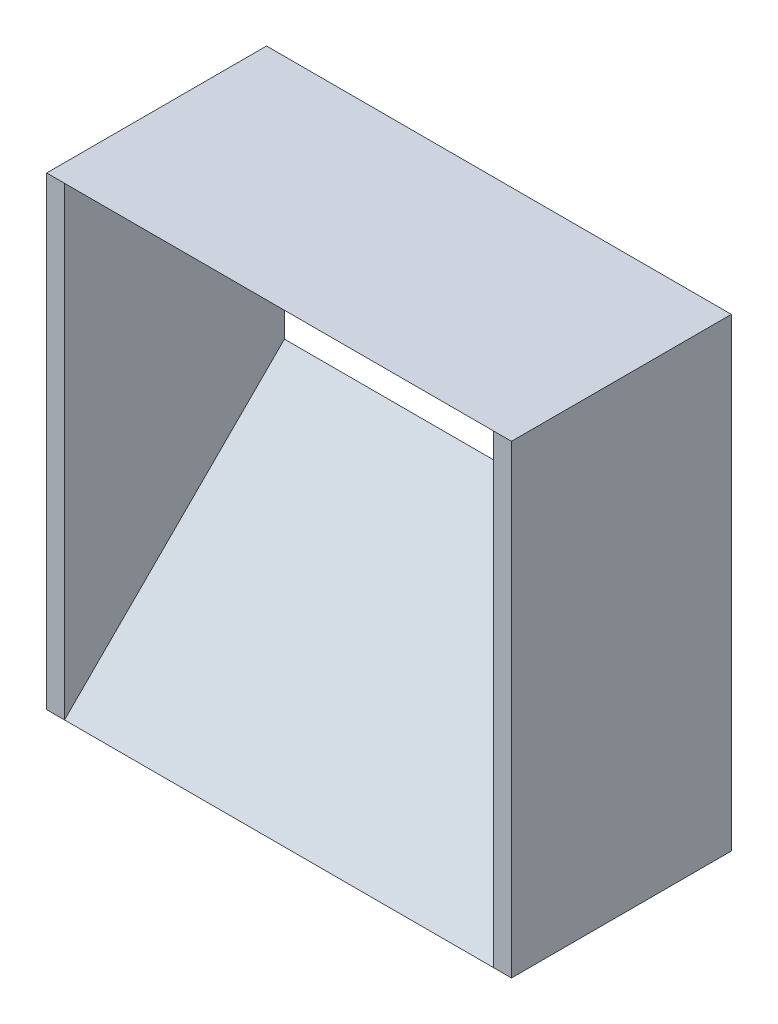
ISO-10303-21;
HEADER;
FILE_DESCRIPTION(('STEP AP214'),'2;1');
FILE_NAME('part.step','',(''),(''),'','','');
FILE_SCHEMA(('AUTOMOTIVE_DESIGN { 1 0 10303 214 1 1 1 1 }'));
ENDSEC;
DATA;
#1=APPLICATION_CONTEXT('core data for automotive mechanical design processes');
#2=APPLICATION_PROTOCOL_DEFINITION('international standard','automotive_design',2000,#1);
#3=PRODUCT_CONTEXT('',#1,'mechanical');
#4=PRODUCT('Part','Part','',(#3));
#5=PRODUCT_RELATED_PRODUCT_CATEGORY('part','',(#4));
#6=PRODUCT_DEFINITION_FORMATION('','',#4);
#7=PRODUCT_DEFINITION_CONTEXT('part definition',#1,'design');
#8=PRODUCT_DEFINITION('design','',#6,#7);
#9=PRODUCT_DEFINITION_SHAPE('','',#8);
#10=(LENGTH_UNIT() NAMED_UNIT(*) SI_UNIT(.MILLI.,.METRE.));
#11=(NAMED_UNIT(*) PLANE_ANGLE_UNIT() SI_UNIT($,.RADIAN.));
#12=(NAMED_UNIT(*) SI_UNIT($,.STERADIAN.) SOLID_ANGLE_UNIT());
#13=UNCERTAINTY_MEASURE_WITH_UNIT(LENGTH_MEASURE(1.E-05),#10,'distance_accuracy_value','');
#14=(GEOMETRIC_REPRESENTATION_CONTEXT(3) GLOBAL_UNCERTAINTY_ASSIGNED_CONTEXT((#13)) GLOBAL_UNIT_ASSIGNED_CONTEXT((#10,
#11,#12)) REPRESENTATION_CONTEXT('',''));
#15=CARTESIAN_POINT('',(0.,0.,0.));
#16=DIRECTION('',(0.,0.,1.));
#17=DIRECTION('',(1.,0.,0.));
#18=AXIS2_PLACEMENT_3D('',#15,#16,#17);
#19=CARTESIAN_POINT('',(60.,0.,0.));
#20=DIRECTION('',(1.,0.,0.));
#21=DIRECTION('',(0.,0.,-1.));
#22=AXIS2_PLACEMENT_3D('',#19,#20,#21);
#23=PLANE('',#22);
#24=DIRECTION('',(0.,-1.,0.));
#25=VECTOR('',#24,1.);
#26=CARTESIAN_POINT('',(60.,-64.9999999999999,61.5000000000003));
#27=LINE('',#26,#25);
#28=CARTESIAN_POINT('',(60.,64.9999999999989,61.5000000000003));
#29=VERTEX_POINT('',#28);
#30=CARTESIAN_POINT('',(60.,-64.9999999999999,61.5000000000003));
#31=VERTEX_POINT('',#30);
#32=EDGE_CURVE('E208',#29,#31,#27,.T.);
#33=ORIENTED_EDGE('',*,*,#32,.F.);
#34=DIRECTION('',(0.,-0.707106781186546,-0.707106781186549));
#35=VECTOR('',#34,1.);
#36=CARTESIAN_POINT('',(60.,3.5,0.));
#37=LINE('',#36,#35);
#38=CARTESIAN_POINT('',(60.,3.5,0.));
#39=VERTEX_POINT('',#38);
#40=EDGE_CURVE('E194',#29,#39,#37,.T.);
#41=ORIENTED_EDGE('',*,*,#40,.T.);
#42=DIRECTION('',(0.,1.,0.));
#43=VECTOR('',#42,1.);
#44=CARTESIAN_POINT('',(60.,-64.9999999999999,0.));
#45=LINE('',#44,#43);
#46=CARTESIAN_POINT('',(60.,-3.5,0.));
#47=VERTEX_POINT('',#46);
#48=EDGE_CURVE('E215',#47,#39,#45,.T.);
#49=ORIENTED_EDGE('',*,*,#48,.F.);
#50=DIRECTION('',(0.,-0.707106781186546,0.707106781186549));
#51=VECTOR('',#50,1.);
#52=CARTESIAN_POINT('',(60.,-64.9999999999999,61.5000000000003));
#53=LINE('',#52,#51);
#54=EDGE_CURVE('E232',#47,#31,#53,.T.);
#55=ORIENTED_EDGE('',*,*,#54,.T.);
#56=EDGE_LOOP('',(#33,#41,#49,#55));
#57=FACE_BOUND('',#56,.T.);
#58=ADVANCED_FACE('F39',(#57),#23,.F.);
#59=CARTESIAN_POINT('',(-60.,-64.9999999999999,61.5000000000003));
#60=DIRECTION('',(0.,-1.,0.));
#61=DIRECTION('',(0.,0.,-1.));
#62=AXIS2_PLACEMENT_3D('',#59,#60,#61);
#63=PLANE('',#62);
#64=DIRECTION('',(1.,0.,0.));
#65=VECTOR('',#64,1.);
#66=CARTESIAN_POINT('',(-60.,-64.9999999999988,0.));
#67=LINE('',#66,#65);
#68=CARTESIAN_POINT('',(-65.,-64.9999999999999,0.));
#69=VERTEX_POINT('',#68);
#70=CARTESIAN_POINT('',(65.,-64.9999999999999,0.));
#71=VERTEX_POINT('',#70);
#72=EDGE_CURVE('E43',#69,#71,#67,.T.);
#73=ORIENTED_EDGE('',*,*,#72,.T.);
#74=DIRECTION('',(0.,0.,-1.));
#75=VECTOR('',#74,1.);
#76=CARTESIAN_POINT('',(65.,-64.9999999999999,61.5000000000003));
#77=LINE('',#76,#75);
#78=CARTESIAN_POINT('',(65.,-64.9999999999999,61.5000000000003));
#79=VERTEX_POINT('',#78);
#80=EDGE_CURVE('E204',#79,#71,#77,.T.);
#81=ORIENTED_EDGE('',*,*,#80,.F.);
#82=DIRECTION('',(-1.,0.,0.));
#83=VECTOR('',#82,1.);
#84=CARTESIAN_POINT('',(65.,-64.9999999999999,61.5000000000003));
#85=LINE('',#84,#83);
#86=EDGE_CURVE('E214',#79,#31,#85,.T.);
#87=ORIENTED_EDGE('',*,*,#86,.T.);
#88=DIRECTION('',(1.,0.,0.));
#89=VECTOR('',#88,1.);
#90=CARTESIAN_POINT('',(-60.,-64.9999999999999,61.5000000000003));
#91=LINE('',#90,#89);
#92=CARTESIAN_POINT('',(-60.,-64.9999999999999,61.5000000000003));
#93=VERTEX_POINT('',#92);
#94=EDGE_CURVE('E11',#93,#31,#91,.T.);
#95=ORIENTED_EDGE('',*,*,#94,.F.);
#96=DIRECTION('',(1.,0.,0.));
#97=VECTOR('',#96,1.);
#98=CARTESIAN_POINT('',(-65.,-64.9999999999999,61.5000000000003));
#99=LINE('',#98,#97);
#100=CARTESIAN_POINT('',(-65.,-64.9999999999999,61.5000000000003));
#101=VERTEX_POINT('',#100);
#102=EDGE_CURVE('E140',#101,#93,#99,.T.);
#103=ORIENTED_EDGE('',*,*,#102,.F.);
#104=DIRECTION('',(0.,0.,-1.));
#105=VECTOR('',#104,1.);
#106=CARTESIAN_POINT('',(-65.,-64.9999999999999,61.5000000000003));
#107=LINE('',#106,#105);
#108=EDGE_CURVE('E142',#101,#69,#107,.T.);
#109=ORIENTED_EDGE('',*,*,#108,.T.);
#110=EDGE_LOOP('',(#73,#81,#87,#95,#103,#109));
#111=FACE_BOUND('',#110,.T.);
#112=ADVANCED_FACE('F41',(#111),#63,.T.);
#113=CARTESIAN_POINT('',(-60.,-64.9999999999999,61.5000000000003));
#114=DIRECTION('',(0.,0.707106781186549,0.707106781186546));
#115=DIRECTION('',(0.,-0.707106781186546,0.707106781186549));
#116=AXIS2_PLACEMENT_3D('',#113,#114,#115);
#117=PLANE('',#116);
#118=ORIENTED_EDGE('',*,*,#94,.T.);
#119=ORIENTED_EDGE('',*,*,#54,.F.);
#120=DIRECTION('',(1.,0.,0.));
#121=VECTOR('',#120,1.);
#122=CARTESIAN_POINT('',(-60.,-3.5,0.));
#123=LINE('',#122,#121);
#124=CARTESIAN_POINT('',(-60.,-3.5,0.));
#125=VERTEX_POINT('',#124);
#126=EDGE_CURVE('E48',#125,#47,#123,.T.);
#127=ORIENTED_EDGE('',*,*,#126,.F.);
#128=DIRECTION('',(0.,-0.707106781186546,0.707106781186549));
#129=VECTOR('',#128,1.);
#130=CARTESIAN_POINT('',(-60.,-64.9999999999999,61.5000000000003));
#131=LINE('',#130,#129);
#132=EDGE_CURVE('E241',#125,#93,#131,.T.);
#133=ORIENTED_EDGE('',*,*,#132,.T.);
#134=EDGE_LOOP('',(#118,#119,#127,#133));
#135=FACE_BOUND('',#134,.T.);
#136=ADVANCED_FACE('F270',(#135),#117,.T.);
#137=CARTESIAN_POINT('',(-60.,-3.5,0.));
#138=DIRECTION('',(0.,0.,-1.));
#139=DIRECTION('',(0.,1.,0.));
#140=AXIS2_PLACEMENT_3D('',#137,#138,#139);
#141=PLANE('',#140);
#142=DIRECTION('',(0.,1.,0.));
#143=VECTOR('',#142,1.);
#144=CARTESIAN_POINT('',(-60.,-64.9999999999999,0.));
#145=LINE('',#144,#143);
#146=CARTESIAN_POINT('',(-60.,-58.9999999999999,0.));
#147=VERTEX_POINT('',#146);
#148=CARTESIAN_POINT('',(-60.,-9.5,0.));
#149=VERTEX_POINT('',#148);
#150=EDGE_CURVE('E161',#147,#149,#145,.T.);
#151=ORIENTED_EDGE('',*,*,#150,.F.);
#152=DIRECTION('',(1.,0.,0.));
#153=VECTOR('',#152,1.);
#154=CARTESIAN_POINT('',(-60.,-58.9999999999998,0.));
#155=LINE('',#154,#153);
#156=CARTESIAN_POINT('',(60.,-58.9999999999998,0.));
#157=VERTEX_POINT('',#156);
#158=EDGE_CURVE('E247',#147,#157,#155,.T.);
#159=ORIENTED_EDGE('',*,*,#158,.T.);
#160=CARTESIAN_POINT('',(60.,-9.5,0.));
#161=VERTEX_POINT('',#160);
#162=EDGE_CURVE('E217',#157,#161,#45,.T.);
#163=ORIENTED_EDGE('',*,*,#162,.T.);
#164=DIRECTION('',(1.,0.,0.));
#165=VECTOR('',#164,1.);
#166=CARTESIAN_POINT('',(-60.,-9.5,0.));
#167=LINE('',#166,#165);
#168=EDGE_CURVE('E244',#149,#161,#167,.T.);
#169=ORIENTED_EDGE('',*,*,#168,.F.);
#170=EDGE_LOOP('',(#151,#159,#163,#169));
#171=FACE_BOUND('',#170,.T.);
#172=CARTESIAN_POINT('',(-60.,3.5,0.));
#173=VERTEX_POINT('',#172);
#174=EDGE_CURVE('E56',#125,#173,#145,.T.);
#175=ORIENTED_EDGE('',*,*,#174,.F.);
#176=ORIENTED_EDGE('',*,*,#126,.T.);
#177=ORIENTED_EDGE('',*,*,#48,.T.);
#178=DIRECTION('',(1.,0.,0.));
#179=VECTOR('',#178,1.);
#180=CARTESIAN_POINT('',(-60.,3.5,0.));
#181=LINE('',#180,#179);
#182=EDGE_CURVE('E150',#173,#39,#181,.T.);
#183=ORIENTED_EDGE('',*,*,#182,.F.);
#184=EDGE_LOOP('',(#175,#176,#177,#183));
#185=FACE_BOUND('',#184,.T.);
#186=CARTESIAN_POINT('',(-60.,9.49999999999999,0.));
#187=VERTEX_POINT('',#186);
#188=CARTESIAN_POINT('',(-60.,58.9999999999998,0.));
#189=VERTEX_POINT('',#188);
#190=EDGE_CURVE('E172',#187,#189,#145,.T.);
#191=ORIENTED_EDGE('',*,*,#190,.F.);
#192=DIRECTION('',(1.,0.,0.));
#193=VECTOR('',#192,1.);
#194=CARTESIAN_POINT('',(-60.,9.5,0.));
#195=LINE('',#194,#193);
#196=CARTESIAN_POINT('',(60.,9.5,0.));
#197=VERTEX_POINT('',#196);
#198=EDGE_CURVE('E175',#187,#197,#195,.T.);
#199=ORIENTED_EDGE('',*,*,#198,.T.);
#200=CARTESIAN_POINT('',(60.,58.9999999999998,0.));
#201=VERTEX_POINT('',#200);
#202=EDGE_CURVE('E203',#197,#201,#45,.T.);
#203=ORIENTED_EDGE('',*,*,#202,.T.);
#204=DIRECTION('',(1.,0.,0.));
#205=VECTOR('',#204,1.);
#206=CARTESIAN_POINT('',(-60.,58.9999999999998,0.));
#207=LINE('',#206,#205);
#208=EDGE_CURVE('E180',#189,#201,#207,.T.);
#209=ORIENTED_EDGE('',*,*,#208,.F.);
#210=EDGE_LOOP('',(#191,#199,#203,#209));
#211=FACE_BOUND('',#210,.T.);
#212=ORIENTED_EDGE('',*,*,#72,.F.);
#213=DIRECTION('',(0.,1.,0.));
#214=VECTOR('',#213,1.);
#215=CARTESIAN_POINT('',(-65.,-64.9999999999999,0.));
#216=LINE('',#215,#214);
#217=CARTESIAN_POINT('',(-65.,64.9999999999989,0.));
#218=VERTEX_POINT('',#217);
#219=EDGE_CURVE('E160',#69,#218,#216,.T.);
#220=ORIENTED_EDGE('',*,*,#219,.T.);
#221=DIRECTION('',(-1.,0.,0.));
#222=VECTOR('',#221,1.);
#223=CARTESIAN_POINT('',(65.,64.9999999999989,0.));
#224=LINE('',#223,#222);
#225=CARTESIAN_POINT('',(65.,64.9999999999989,0.));
#226=VERTEX_POINT('',#225);
#227=EDGE_CURVE('E224',#226,#218,#224,.T.);
#228=ORIENTED_EDGE('',*,*,#227,.F.);
#229=DIRECTION('',(0.,1.,0.));
#230=VECTOR('',#229,1.);
#231=CARTESIAN_POINT('',(65.,-64.9999999999999,0.));
#232=LINE('',#231,#230);
#233=EDGE_CURVE('E207',#71,#226,#232,.T.);
#234=ORIENTED_EDGE('',*,*,#233,.F.);
#235=EDGE_LOOP('',(#212,#220,#228,#234));
#236=FACE_BOUND('',#235,.T.);
#237=ADVANCED_FACE('F257',(#171,#185,#211,#236),#141,.T.);
#238=CARTESIAN_POINT('',(-60.,-59.,49.5000000000002));
#239=DIRECTION('',(0.,-0.707106781186549,-0.707106781186546));
#240=DIRECTION('',(0.,0.707106781186546,-0.707106781186549));
#241=AXIS2_PLACEMENT_3D('',#238,#239,#240);
#242=PLANE('',#241);
#243=ORIENTED_EDGE('',*,*,#168,.T.);
#244=DIRECTION('',(0.,0.707106781186546,-0.707106781186549));
#245=VECTOR('',#244,1.);
#246=CARTESIAN_POINT('',(60.,-59.,49.5000000000002));
#247=LINE('',#246,#245);
#248=CARTESIAN_POINT('',(60.,-59.,49.5000000000002));
#249=VERTEX_POINT('',#248);
#250=EDGE_CURVE('E229',#249,#161,#247,.T.);
#251=ORIENTED_EDGE('',*,*,#250,.F.);
#252=DIRECTION('',(1.,0.,0.));
#253=VECTOR('',#252,1.);
#254=CARTESIAN_POINT('',(-60.,-59.,49.5000000000002));
#255=LINE('',#254,#253);
#256=CARTESIAN_POINT('',(-60.,-59.,49.5000000000002));
#257=VERTEX_POINT('',#256);
#258=EDGE_CURVE('E246',#257,#249,#255,.T.);
#259=ORIENTED_EDGE('',*,*,#258,.F.);
#260=DIRECTION('',(0.,0.707106781186546,-0.707106781186549));
#261=VECTOR('',#260,1.);
#262=CARTESIAN_POINT('',(-60.,-59.,49.5000000000002));
#263=LINE('',#262,#261);
#264=EDGE_CURVE('E238',#257,#149,#263,.T.);
#265=ORIENTED_EDGE('',*,*,#264,.T.);
#266=EDGE_LOOP('',(#243,#251,#259,#265));
#267=FACE_BOUND('',#266,.T.);
#268=ADVANCED_FACE('F302',(#267),#242,.T.);
#269=CARTESIAN_POINT('',(-60.,-58.9999999999998,0.));
#270=DIRECTION('',(0.,1.,0.));
#271=DIRECTION('',(0.,0.,1.));
#272=AXIS2_PLACEMENT_3D('',#269,#270,#271);
#273=PLANE('',#272);
#274=ORIENTED_EDGE('',*,*,#258,.T.);
#275=DIRECTION('',(0.,0.,1.));
#276=VECTOR('',#275,1.);
#277=CARTESIAN_POINT('',(60.,-58.9999999999998,0.));
#278=LINE('',#277,#276);
#279=EDGE_CURVE('E226',#157,#249,#278,.T.);
#280=ORIENTED_EDGE('',*,*,#279,.F.);
#281=ORIENTED_EDGE('',*,*,#158,.F.);
#282=DIRECTION('',(0.,0.,1.));
#283=VECTOR('',#282,1.);
#284=CARTESIAN_POINT('',(-60.,-58.9999999999998,0.));
#285=LINE('',#284,#283);
#286=EDGE_CURVE('E235',#147,#257,#285,.T.);
#287=ORIENTED_EDGE('',*,*,#286,.T.);
#288=EDGE_LOOP('',(#274,#280,#281,#287));
#289=FACE_BOUND('',#288,.T.);
#290=ADVANCED_FACE('F298',(#289),#273,.T.);
#291=ORIENTED_EDGE('',*,*,#162,.F.);
#292=ORIENTED_EDGE('',*,*,#279,.T.);
#293=ORIENTED_EDGE('',*,*,#250,.T.);
#294=EDGE_LOOP('',(#291,#292,#293));
#295=FACE_BOUND('',#294,.T.);
#296=ADVANCED_FACE('F288',(#295),#23,.F.);
#297=DIRECTION('',(0.,0.707106781186546,0.707106781186549));
#298=VECTOR('',#297,1.);
#299=CARTESIAN_POINT('',(60.,58.9999999999998,49.5));
#300=LINE('',#299,#298);
#301=CARTESIAN_POINT('',(60.,58.9999999999998,49.5));
#302=VERTEX_POINT('',#301);
#303=EDGE_CURVE('E200',#197,#302,#300,.T.);
#304=ORIENTED_EDGE('',*,*,#303,.T.);
#305=DIRECTION('',(0.,0.,-1.));
#306=VECTOR('',#305,1.);
#307=CARTESIAN_POINT('',(60.,58.9999999999998,0.));
#308=LINE('',#307,#306);
#309=EDGE_CURVE('E197',#302,#201,#308,.T.);
#310=ORIENTED_EDGE('',*,*,#309,.T.);
#311=ORIENTED_EDGE('',*,*,#202,.F.);
#312=EDGE_LOOP('',(#304,#310,#311));
#313=FACE_BOUND('',#312,.T.);
#314=ADVANCED_FACE('F279',(#313),#23,.F.);
#315=CARTESIAN_POINT('',(65.,64.9999999999989,61.5000000000003));
#316=DIRECTION('',(0.,-1.,0.));
#317=DIRECTION('',(0.,0.,-1.));
#318=AXIS2_PLACEMENT_3D('',#315,#316,#317);
#319=PLANE('',#318);
#320=ORIENTED_EDGE('',*,*,#227,.T.);
#321=DIRECTION('',(0.,0.,1.));
#322=VECTOR('',#321,1.);
#323=CARTESIAN_POINT('',(-65.,64.9999999999989,61.5000000000003));
#324=LINE('',#323,#322);
#325=CARTESIAN_POINT('',(-65.,64.9999999999989,61.5000000000003));
#326=VERTEX_POINT('',#325);
#327=EDGE_CURVE('E165',#218,#326,#324,.T.);
#328=ORIENTED_EDGE('',*,*,#327,.T.);
#329=DIRECTION('',(1.,0.,0.));
#330=VECTOR('',#329,1.);
#331=CARTESIAN_POINT('',(-65.,64.9999999999989,61.5000000000003));
#332=LINE('',#331,#330);
#333=CARTESIAN_POINT('',(-60.,64.9999999999989,61.5000000000003));
#334=VERTEX_POINT('',#333);
#335=EDGE_CURVE('E151',#326,#334,#332,.T.);
#336=ORIENTED_EDGE('',*,*,#335,.T.);
#337=DIRECTION('',(1.,0.,0.));
#338=VECTOR('',#337,1.);
#339=CARTESIAN_POINT('',(-60.,65.,61.5000000000003));
#340=LINE('',#339,#338);
#341=EDGE_CURVE('E182',#334,#29,#340,.T.);
#342=ORIENTED_EDGE('',*,*,#341,.T.);
#343=DIRECTION('',(-1.,0.,0.));
#344=VECTOR('',#343,1.);
#345=CARTESIAN_POINT('',(65.,64.9999999999989,61.5000000000003));
#346=LINE('',#345,#344);
#347=CARTESIAN_POINT('',(65.,64.9999999999989,61.5000000000003));
#348=VERTEX_POINT('',#347);
#349=EDGE_CURVE('E221',#348,#29,#346,.T.);
#350=ORIENTED_EDGE('',*,*,#349,.F.);
#351=DIRECTION('',(0.,0.,1.));
#352=VECTOR('',#351,1.);
#353=CARTESIAN_POINT('',(65.,64.9999999999989,61.5000000000003));
#354=LINE('',#353,#352);
#355=EDGE_CURVE('E210',#226,#348,#354,.T.);
#356=ORIENTED_EDGE('',*,*,#355,.F.);
#357=EDGE_LOOP('',(#320,#328,#336,#342,#350,#356));
#358=FACE_BOUND('',#357,.T.);
#359=ADVANCED_FACE('F277',(#358),#319,.F.);
#360=CARTESIAN_POINT('',(65.,-64.9999999999999,61.5000000000003));
#361=DIRECTION('',(0.,0.,-1.));
#362=DIRECTION('',(-1.,0.,0.));
#363=AXIS2_PLACEMENT_3D('',#360,#361,#362);
#364=PLANE('',#363);
#365=ORIENTED_EDGE('',*,*,#32,.T.);
#366=ORIENTED_EDGE('',*,*,#86,.F.);
#367=DIRECTION('',(0.,-1.,0.));
#368=VECTOR('',#367,1.);
#369=CARTESIAN_POINT('',(65.,-64.9999999999999,61.5000000000003));
#370=LINE('',#369,#368);
#371=EDGE_CURVE('E212',#348,#79,#370,.T.);
#372=ORIENTED_EDGE('',*,*,#371,.F.);
#373=ORIENTED_EDGE('',*,*,#349,.T.);
#374=EDGE_LOOP('',(#365,#366,#372,#373));
#375=FACE_BOUND('',#374,.T.);
#376=ADVANCED_FACE('F265',(#375),#364,.F.);
#377=CARTESIAN_POINT('',(65.,0.,0.));
#378=DIRECTION('',(1.,0.,0.));
#379=DIRECTION('',(0.,0.,-1.));
#380=AXIS2_PLACEMENT_3D('',#377,#378,#379);
#381=PLANE('',#380);
#382=ORIENTED_EDGE('',*,*,#80,.T.);
#383=ORIENTED_EDGE('',*,*,#233,.T.);
#384=ORIENTED_EDGE('',*,*,#355,.T.);
#385=ORIENTED_EDGE('',*,*,#371,.T.);
#386=EDGE_LOOP('',(#382,#383,#384,#385));
#387=FACE_BOUND('',#386,.T.);
#388=ADVANCED_FACE('F260',(#387),#381,.T.);
#389=CARTESIAN_POINT('',(-60.,3.5,0.));
#390=DIRECTION('',(0.,-0.707106781186549,0.707106781186546));
#391=DIRECTION('',(0.,-0.707106781186546,-0.707106781186549));
#392=AXIS2_PLACEMENT_3D('',#389,#390,#391);
#393=PLANE('',#392);
#394=ORIENTED_EDGE('',*,*,#182,.T.);
#395=ORIENTED_EDGE('',*,*,#40,.F.);
#396=ORIENTED_EDGE('',*,*,#341,.F.);
#397=DIRECTION('',(0.,-0.707106781186546,-0.707106781186549));
#398=VECTOR('',#397,1.);
#399=CARTESIAN_POINT('',(-60.,3.5,0.));
#400=LINE('',#399,#398);
#401=EDGE_CURVE('E177',#334,#173,#400,.T.);
#402=ORIENTED_EDGE('',*,*,#401,.T.);
#403=EDGE_LOOP('',(#394,#395,#396,#402));
#404=FACE_BOUND('',#403,.T.);
#405=ADVANCED_FACE('F275',(#404),#393,.T.);
#406=CARTESIAN_POINT('',(-60.,58.9999999999998,0.));
#407=DIRECTION('',(0.,-1.,0.));
#408=DIRECTION('',(0.,0.,-1.));
#409=AXIS2_PLACEMENT_3D('',#406,#407,#408);
#410=PLANE('',#409);
#411=ORIENTED_EDGE('',*,*,#208,.T.);
#412=ORIENTED_EDGE('',*,*,#309,.F.);
#413=DIRECTION('',(1.,0.,0.));
#414=VECTOR('',#413,1.);
#415=CARTESIAN_POINT('',(-60.,58.9999999999998,49.5));
#416=LINE('',#415,#414);
#417=CARTESIAN_POINT('',(-60.,58.9999999999998,49.5));
#418=VERTEX_POINT('',#417);
#419=EDGE_CURVE('E178',#418,#302,#416,.T.);
#420=ORIENTED_EDGE('',*,*,#419,.F.);
#421=DIRECTION('',(0.,0.,-1.));
#422=VECTOR('',#421,1.);
#423=CARTESIAN_POINT('',(-60.,58.9999999999998,0.));
#424=LINE('',#423,#422);
#425=EDGE_CURVE('E188',#418,#189,#424,.T.);
#426=ORIENTED_EDGE('',*,*,#425,.T.);
#427=EDGE_LOOP('',(#411,#412,#420,#426));
#428=FACE_BOUND('',#427,.T.);
#429=ADVANCED_FACE('F317',(#428),#410,.T.);
#430=CARTESIAN_POINT('',(-60.,58.9999999999998,49.5));
#431=DIRECTION('',(0.,0.707106781186549,-0.707106781186546));
#432=DIRECTION('',(0.,0.707106781186546,0.707106781186549));
#433=AXIS2_PLACEMENT_3D('',#430,#431,#432);
#434=PLANE('',#433);
#435=ORIENTED_EDGE('',*,*,#419,.T.);
#436=ORIENTED_EDGE('',*,*,#303,.F.);
#437=ORIENTED_EDGE('',*,*,#198,.F.);
#438=DIRECTION('',(0.,0.707106781186546,0.707106781186549));
#439=VECTOR('',#438,1.);
#440=CARTESIAN_POINT('',(-60.,58.9999999999998,49.5));
#441=LINE('',#440,#439);
#442=EDGE_CURVE('E191',#187,#418,#441,.T.);
#443=ORIENTED_EDGE('',*,*,#442,.T.);
#444=EDGE_LOOP('',(#435,#436,#437,#443));
#445=FACE_BOUND('',#444,.T.);
#446=ADVANCED_FACE('F321',(#445),#434,.T.);
#447=CARTESIAN_POINT('',(-60.,0.,0.));
#448=DIRECTION('',(-1.,0.,0.));
#449=DIRECTION('',(0.,0.,-1.));
#450=AXIS2_PLACEMENT_3D('',#447,#448,#449);
#451=PLANE('',#450);
#452=ORIENTED_EDGE('',*,*,#132,.F.);
#453=ORIENTED_EDGE('',*,*,#174,.T.);
#454=ORIENTED_EDGE('',*,*,#401,.F.);
#455=DIRECTION('',(0.,-1.,0.));
#456=VECTOR('',#455,1.);
#457=CARTESIAN_POINT('',(-60.,-64.9999999999999,61.5000000000003));
#458=LINE('',#457,#456);
#459=EDGE_CURVE('E170',#334,#93,#458,.T.);
#460=ORIENTED_EDGE('',*,*,#459,.T.);
#461=EDGE_LOOP('',(#452,#453,#454,#460));
#462=FACE_BOUND('',#461,.T.);
#463=ADVANCED_FACE('F272',(#462),#451,.F.);
#464=ORIENTED_EDGE('',*,*,#264,.F.);
#465=ORIENTED_EDGE('',*,*,#286,.F.);
#466=ORIENTED_EDGE('',*,*,#150,.T.);
#467=EDGE_LOOP('',(#464,#465,#466));
#468=FACE_BOUND('',#467,.T.);
#469=ADVANCED_FACE('F328',(#468),#451,.F.);
#470=CARTESIAN_POINT('',(-65.,-64.9999999999999,61.5000000000003));
#471=DIRECTION('',(0.,0.,1.));
#472=DIRECTION('',(1.,0.,0.));
#473=AXIS2_PLACEMENT_3D('',#470,#471,#472);
#474=PLANE('',#473);
#475=ORIENTED_EDGE('',*,*,#459,.F.);
#476=ORIENTED_EDGE('',*,*,#335,.F.);
#477=DIRECTION('',(0.,-1.,0.));
#478=VECTOR('',#477,1.);
#479=CARTESIAN_POINT('',(-65.,-64.9999999999999,61.5000000000003));
#480=LINE('',#479,#478);
#481=EDGE_CURVE('E157',#326,#101,#480,.T.);
#482=ORIENTED_EDGE('',*,*,#481,.T.);
#483=ORIENTED_EDGE('',*,*,#102,.T.);
#484=EDGE_LOOP('',(#475,#476,#482,#483));
#485=FACE_BOUND('',#484,.T.);
#486=ADVANCED_FACE('F163',(#485),#474,.T.);
#487=CARTESIAN_POINT('',(-65.,0.,0.));
#488=DIRECTION('',(-1.,0.,0.));
#489=DIRECTION('',(0.,0.,-1.));
#490=AXIS2_PLACEMENT_3D('',#487,#488,#489);
#491=PLANE('',#490);
#492=ORIENTED_EDGE('',*,*,#108,.F.);
#493=ORIENTED_EDGE('',*,*,#481,.F.);
#494=ORIENTED_EDGE('',*,*,#327,.F.);
#495=ORIENTED_EDGE('',*,*,#219,.F.);
#496=EDGE_LOOP('',(#492,#493,#494,#495));
#497=FACE_BOUND('',#496,.T.);
#498=ADVANCED_FACE('F155',(#497),#491,.T.);
#499=ORIENTED_EDGE('',*,*,#425,.F.);
#500=ORIENTED_EDGE('',*,*,#442,.F.);
#501=ORIENTED_EDGE('',*,*,#190,.T.);
#502=EDGE_LOOP('',(#499,#500,#501));
#503=FACE_BOUND('',#502,.T.);
#504=ADVANCED_FACE('F319',(#503),#451,.F.);
#505=CLOSED_SHELL('',(#58,#112,#136,#237,#268,#290,#296,#314,#359,#376,#388,#405,#429,#446,#463,
#469,#486,#498,#504));
#506=MANIFOLD_SOLID_BREP('B2',#505);
#507=ADVANCED_BREP_SHAPE_REPRESENTATION('',(#18,#506),#14);
#508=SHAPE_DEFINITION_REPRESENTATION(#9,#507);
ENDSEC;
END-ISO-10303-21;
